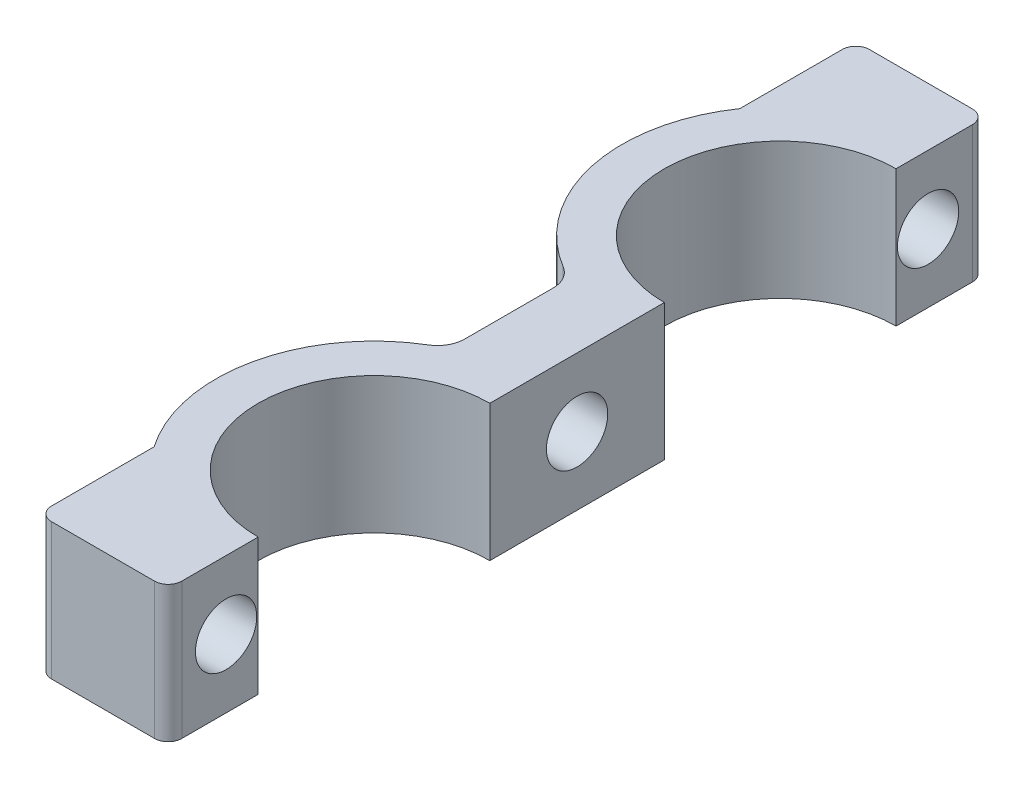
ISO-10303-21;
HEADER;
FILE_DESCRIPTION(('STEP AP214'),'2;1');
FILE_NAME('part.step','',(''),(''),'','','');
FILE_SCHEMA(('AUTOMOTIVE_DESIGN { 1 0 10303 214 1 1 1 1 }'));
ENDSEC;
DATA;
#1=APPLICATION_CONTEXT('core data for automotive mechanical design processes');
#2=APPLICATION_PROTOCOL_DEFINITION('international standard','automotive_design',2000,#1);
#3=PRODUCT_CONTEXT('',#1,'mechanical');
#4=PRODUCT('Part','Part','',(#3));
#5=PRODUCT_RELATED_PRODUCT_CATEGORY('part','',(#4));
#6=PRODUCT_DEFINITION_FORMATION('','',#4);
#7=PRODUCT_DEFINITION_CONTEXT('part definition',#1,'design');
#8=PRODUCT_DEFINITION('design','',#6,#7);
#9=PRODUCT_DEFINITION_SHAPE('','',#8);
#10=(LENGTH_UNIT() NAMED_UNIT(*) SI_UNIT(.MILLI.,.METRE.));
#11=(NAMED_UNIT(*) PLANE_ANGLE_UNIT() SI_UNIT($,.RADIAN.));
#12=(NAMED_UNIT(*) SI_UNIT($,.STERADIAN.) SOLID_ANGLE_UNIT());
#13=UNCERTAINTY_MEASURE_WITH_UNIT(LENGTH_MEASURE(1.E-05),#10,'distance_accuracy_value','');
#14=(GEOMETRIC_REPRESENTATION_CONTEXT(3) GLOBAL_UNCERTAINTY_ASSIGNED_CONTEXT((#13)) GLOBAL_UNIT_ASSIGNED_CONTEXT((#10,
#11,#12)) REPRESENTATION_CONTEXT('',''));
#15=CARTESIAN_POINT('',(0.,0.,0.));
#16=DIRECTION('',(0.,0.,1.));
#17=DIRECTION('',(1.,0.,0.));
#18=AXIS2_PLACEMENT_3D('',#15,#16,#17);
#19=CARTESIAN_POINT('',(0.,10.,0.));
#20=DIRECTION('',(-1.,0.,0.));
#21=DIRECTION('',(0.,0.,1.));
#22=AXIS2_PLACEMENT_3D('',#19,#20,#21);
#23=PLANE('',#22);
#24=DIRECTION('',(0.,0.,-1.));
#25=VECTOR('',#24,1.);
#26=CARTESIAN_POINT('',(0.,0.,0.));
#27=LINE('',#26,#25);
#28=CARTESIAN_POINT('',(0.,0.,-1.));
#29=VERTEX_POINT('',#28);
#30=CARTESIAN_POINT('',(0.,0.,-6.59999999999999));
#31=VERTEX_POINT('',#30);
#32=EDGE_CURVE('E196',#29,#31,#27,.T.);
#33=ORIENTED_EDGE('',*,*,#32,.T.);
#34=DIRECTION('',(0.,1.,0.));
#35=VECTOR('',#34,1.);
#36=CARTESIAN_POINT('',(0.,0.,-6.59999999999999));
#37=LINE('',#36,#35);
#38=CARTESIAN_POINT('',(0.,10.,-6.59999999999999));
#39=VERTEX_POINT('',#38);
#40=EDGE_CURVE('E318',#31,#39,#37,.T.);
#41=ORIENTED_EDGE('',*,*,#40,.T.);
#42=DIRECTION('',(0.,0.,-1.));
#43=VECTOR('',#42,1.);
#44=CARTESIAN_POINT('',(0.,10.,0.));
#45=LINE('',#44,#43);
#46=CARTESIAN_POINT('',(0.,10.,-1.));
#47=VERTEX_POINT('',#46);
#48=EDGE_CURVE('E303',#47,#39,#45,.T.);
#49=ORIENTED_EDGE('',*,*,#48,.F.);
#50=DIRECTION('',(0.,-1.,0.));
#51=VECTOR('',#50,1.);
#52=CARTESIAN_POINT('',(0.,10.,-1.));
#53=LINE('',#52,#51);
#54=EDGE_CURVE('E209',#47,#29,#53,.T.);
#55=ORIENTED_EDGE('',*,*,#54,.T.);
#56=EDGE_LOOP('',(#33,#41,#49,#55));
#57=FACE_BOUND('',#56,.T.);
#58=CARTESIAN_POINT('',(0.,5.,-4.25000000000001));
#59=DIRECTION('',(-1.,0.,0.));
#60=DIRECTION('',(0.,0.,-1.));
#61=AXIS2_PLACEMENT_3D('',#58,#59,#60);
#62=CIRCLE('',#61,2.25);
#63=CARTESIAN_POINT('',(0.,5.,-6.50000000000001));
#64=VERTEX_POINT('',#63);
#65=EDGE_CURVE('E208',#64,#64,#62,.T.);
#66=ORIENTED_EDGE('',*,*,#65,.T.);
#67=EDGE_LOOP('',(#66));
#68=FACE_BOUND('',#67,.T.);
#69=ADVANCED_FACE('F39',(#57,#68),#23,.F.);
#70=CARTESIAN_POINT('',(-9.54984471899927,10.,0.));
#71=DIRECTION('',(1.,0.,0.));
#72=DIRECTION('',(0.,0.,-1.));
#73=AXIS2_PLACEMENT_3D('',#70,#71,#72);
#74=PLANE('',#73);
#75=DIRECTION('',(0.,0.,1.));
#76=VECTOR('',#75,1.);
#77=CARTESIAN_POINT('',(-9.54984471899927,0.,0.));
#78=LINE('',#77,#76);
#79=CARTESIAN_POINT('',(-9.54984471899927,0.,-8.51513357439941));
#80=VERTEX_POINT('',#79);
#81=CARTESIAN_POINT('',(-9.54984471899927,0.,-1.));
#82=VERTEX_POINT('',#81);
#83=EDGE_CURVE('E203',#80,#82,#78,.T.);
#84=ORIENTED_EDGE('',*,*,#83,.T.);
#85=DIRECTION('',(0.,-1.,0.));
#86=VECTOR('',#85,1.);
#87=CARTESIAN_POINT('',(-9.54984471899927,10.,-1.));
#88=LINE('',#87,#86);
#89=CARTESIAN_POINT('',(-9.54984471899927,10.,-1.));
#90=VERTEX_POINT('',#89);
#91=EDGE_CURVE('E236',#82,#90,#88,.F.);
#92=ORIENTED_EDGE('',*,*,#91,.T.);
#93=DIRECTION('',(0.,0.,1.));
#94=VECTOR('',#93,1.);
#95=CARTESIAN_POINT('',(-9.54984471899927,10.,0.));
#96=LINE('',#95,#94);
#97=CARTESIAN_POINT('',(-9.54984471899927,10.,-8.51513357439941));
#98=VERTEX_POINT('',#97);
#99=EDGE_CURVE('E279',#98,#90,#96,.T.);
#100=ORIENTED_EDGE('',*,*,#99,.F.);
#101=DIRECTION('',(0.,-1.,0.));
#102=VECTOR('',#101,1.);
#103=CARTESIAN_POINT('',(-9.54984471899927,10.,-8.51513357439941));
#104=LINE('',#103,#102);
#105=EDGE_CURVE('E275',#98,#80,#104,.T.);
#106=ORIENTED_EDGE('',*,*,#105,.T.);
#107=EDGE_LOOP('',(#84,#92,#100,#106));
#108=FACE_BOUND('',#107,.T.);
#109=CARTESIAN_POINT('',(-9.54984471899927,5.,-4.25000000000001));
#110=DIRECTION('',(1.,0.,0.));
#111=DIRECTION('',(0.,0.,-1.));
#112=AXIS2_PLACEMENT_3D('',#109,#110,#111);
#113=CIRCLE('',#112,2.25);
#114=CARTESIAN_POINT('',(-9.54984471899927,5.,-6.50000000000001));
#115=VERTEX_POINT('',#114);
#116=EDGE_CURVE('E205',#115,#115,#113,.F.);
#117=ORIENTED_EDGE('',*,*,#116,.F.);
#118=EDGE_LOOP('',(#117));
#119=FACE_BOUND('',#118,.T.);
#120=ADVANCED_FACE('F362',(#108,#119),#74,.F.);
#121=CARTESIAN_POINT('',(0.,10.,-60.));
#122=DIRECTION('',(-1.,0.,0.));
#123=DIRECTION('',(0.,0.,1.));
#124=AXIS2_PLACEMENT_3D('',#121,#122,#123);
#125=PLANE('',#124);
#126=DIRECTION('',(0.,0.,-1.));
#127=VECTOR('',#126,1.);
#128=CARTESIAN_POINT('',(0.,10.,-60.));
#129=LINE('',#128,#127);
#130=CARTESIAN_POINT('',(0.,10.,-53.4));
#131=VERTEX_POINT('',#130);
#132=CARTESIAN_POINT('',(0.,10.,-59.));
#133=VERTEX_POINT('',#132);
#134=EDGE_CURVE('E183',#131,#133,#129,.T.);
#135=ORIENTED_EDGE('',*,*,#134,.F.);
#136=DIRECTION('',(0.,1.,0.));
#137=VECTOR('',#136,1.);
#138=CARTESIAN_POINT('',(0.,0.,-53.4));
#139=LINE('',#138,#137);
#140=CARTESIAN_POINT('',(0.,0.,-53.4));
#141=VERTEX_POINT('',#140);
#142=EDGE_CURVE('E166',#141,#131,#139,.T.);
#143=ORIENTED_EDGE('',*,*,#142,.F.);
#144=DIRECTION('',(0.,0.,-1.));
#145=VECTOR('',#144,1.);
#146=CARTESIAN_POINT('',(0.,0.,-60.));
#147=LINE('',#146,#145);
#148=CARTESIAN_POINT('',(0.,0.,-59.));
#149=VERTEX_POINT('',#148);
#150=EDGE_CURVE('E181',#141,#149,#147,.T.);
#151=ORIENTED_EDGE('',*,*,#150,.T.);
#152=DIRECTION('',(0.,-1.,0.));
#153=VECTOR('',#152,1.);
#154=CARTESIAN_POINT('',(0.,10.,-59.));
#155=LINE('',#154,#153);
#156=EDGE_CURVE('E227',#149,#133,#155,.F.);
#157=ORIENTED_EDGE('',*,*,#156,.T.);
#158=EDGE_LOOP('',(#135,#143,#151,#157));
#159=FACE_BOUND('',#158,.T.);
#160=CARTESIAN_POINT('',(0.,5.,-55.75));
#161=DIRECTION('',(-1.,0.,0.));
#162=DIRECTION('',(0.,0.,1.));
#163=AXIS2_PLACEMENT_3D('',#160,#161,#162);
#164=CIRCLE('',#163,2.25);
#165=CARTESIAN_POINT('',(0.,5.,-53.5));
#166=VERTEX_POINT('',#165);
#167=EDGE_CURVE('E204',#166,#166,#164,.T.);
#168=ORIENTED_EDGE('',*,*,#167,.T.);
#169=EDGE_LOOP('',(#168));
#170=FACE_BOUND('',#169,.T.);
#171=ADVANCED_FACE('F178',(#159,#170),#125,.F.);
#172=CARTESIAN_POINT('',(-9.54984471899922,10.,0.));
#173=DIRECTION('',(1.,0.,0.));
#174=DIRECTION('',(0.,0.,-1.));
#175=AXIS2_PLACEMENT_3D('',#172,#173,#174);
#176=PLANE('',#175);
#177=DIRECTION('',(0.,0.,1.));
#178=VECTOR('',#177,1.);
#179=CARTESIAN_POINT('',(-9.54984471899922,10.,0.));
#180=LINE('',#179,#178);
#181=CARTESIAN_POINT('',(-9.54984471899923,10.,-59.));
#182=VERTEX_POINT('',#181);
#183=CARTESIAN_POINT('',(-9.54984471899923,10.,-51.4848664256006));
#184=VERTEX_POINT('',#183);
#185=EDGE_CURVE('E288',#182,#184,#180,.T.);
#186=ORIENTED_EDGE('',*,*,#185,.F.);
#187=DIRECTION('',(0.,-1.,0.));
#188=VECTOR('',#187,1.);
#189=CARTESIAN_POINT('',(-9.54984471899923,10.,-59.));
#190=LINE('',#189,#188);
#191=CARTESIAN_POINT('',(-9.54984471899923,0.,-59.));
#192=VERTEX_POINT('',#191);
#193=EDGE_CURVE('E242',#182,#192,#190,.T.);
#194=ORIENTED_EDGE('',*,*,#193,.T.);
#195=DIRECTION('',(0.,0.,1.));
#196=VECTOR('',#195,1.);
#197=CARTESIAN_POINT('',(-9.54984471899922,0.,0.));
#198=LINE('',#197,#196);
#199=CARTESIAN_POINT('',(-9.54984471899923,0.,-51.4848664256006));
#200=VERTEX_POINT('',#199);
#201=EDGE_CURVE('E283',#192,#200,#198,.T.);
#202=ORIENTED_EDGE('',*,*,#201,.T.);
#203=DIRECTION('',(0.,-1.,0.));
#204=VECTOR('',#203,1.);
#205=CARTESIAN_POINT('',(-9.54984471899923,10.,-51.4848664256006));
#206=LINE('',#205,#204);
#207=EDGE_CURVE('E297',#184,#200,#206,.T.);
#208=ORIENTED_EDGE('',*,*,#207,.F.);
#209=EDGE_LOOP('',(#186,#194,#202,#208));
#210=FACE_BOUND('',#209,.T.);
#211=CARTESIAN_POINT('',(-9.54984471899923,5.,-55.75));
#212=DIRECTION('',(1.,0.,0.));
#213=DIRECTION('',(0.,0.,-1.));
#214=AXIS2_PLACEMENT_3D('',#211,#212,#213);
#215=CIRCLE('',#214,2.25);
#216=CARTESIAN_POINT('',(-9.54984471899923,5.,-58.));
#217=VERTEX_POINT('',#216);
#218=EDGE_CURVE('E200',#217,#217,#215,.F.);
#219=ORIENTED_EDGE('',*,*,#218,.F.);
#220=EDGE_LOOP('',(#219));
#221=FACE_BOUND('',#220,.T.);
#222=ADVANCED_FACE('F350',(#210,#221),#176,.F.);
#223=CARTESIAN_POINT('',(-3.,10.,0.));
#224=DIRECTION('',(0.,0.,-1.));
#225=DIRECTION('',(-1.,0.,0.));
#226=AXIS2_PLACEMENT_3D('',#223,#224,#225);
#227=PLANE('',#226);
#228=DIRECTION('',(1.,0.,0.));
#229=VECTOR('',#228,1.);
#230=CARTESIAN_POINT('',(-3.,10.,0.));
#231=LINE('',#230,#229);
#232=CARTESIAN_POINT('',(-8.54984471899927,10.,0.));
#233=VERTEX_POINT('',#232);
#234=CARTESIAN_POINT('',(-1.,10.,0.));
#235=VERTEX_POINT('',#234);
#236=EDGE_CURVE('E194',#233,#235,#231,.T.);
#237=ORIENTED_EDGE('',*,*,#236,.F.);
#238=DIRECTION('',(0.,-1.,0.));
#239=VECTOR('',#238,1.);
#240=CARTESIAN_POINT('',(-8.54984471899927,10.,0.));
#241=LINE('',#240,#239);
#242=CARTESIAN_POINT('',(-8.54984471899927,0.,0.));
#243=VERTEX_POINT('',#242);
#244=EDGE_CURVE('E229',#233,#243,#241,.T.);
#245=ORIENTED_EDGE('',*,*,#244,.T.);
#246=DIRECTION('',(1.,0.,0.));
#247=VECTOR('',#246,1.);
#248=CARTESIAN_POINT('',(-3.,0.,0.));
#249=LINE('',#248,#247);
#250=CARTESIAN_POINT('',(-1.,0.,0.));
#251=VERTEX_POINT('',#250);
#252=EDGE_CURVE('E300',#243,#251,#249,.T.);
#253=ORIENTED_EDGE('',*,*,#252,.T.);
#254=DIRECTION('',(0.,-1.,0.));
#255=VECTOR('',#254,1.);
#256=CARTESIAN_POINT('',(-1.,10.,0.));
#257=LINE('',#256,#255);
#258=EDGE_CURVE('E217',#251,#235,#257,.F.);
#259=ORIENTED_EDGE('',*,*,#258,.T.);
#260=EDGE_LOOP('',(#237,#245,#253,#259));
#261=FACE_BOUND('',#260,.T.);
#262=ADVANCED_FACE('F352',(#261),#227,.F.);
#263=CARTESIAN_POINT('',(0.,10.,-37.8));
#264=DIRECTION('',(-1.,0.,0.));
#265=DIRECTION('',(0.,0.,1.));
#266=AXIS2_PLACEMENT_3D('',#263,#264,#265);
#267=PLANE('',#266);
#268=CARTESIAN_POINT('',(0.,5.,-30.));
#269=DIRECTION('',(-1.,0.,0.));
#270=DIRECTION('',(0.,0.,1.));
#271=AXIS2_PLACEMENT_3D('',#268,#269,#270);
#272=CIRCLE('',#271,2.25);
#273=CARTESIAN_POINT('',(0.,5.,-27.75));
#274=VERTEX_POINT('',#273);
#275=EDGE_CURVE('E334',#274,#274,#272,.T.);
#276=ORIENTED_EDGE('',*,*,#275,.T.);
#277=EDGE_LOOP('',(#276));
#278=FACE_BOUND('',#277,.T.);
#279=DIRECTION('',(0.,0.,-1.));
#280=VECTOR('',#279,1.);
#281=CARTESIAN_POINT('',(0.,0.,-37.8));
#282=LINE('',#281,#280);
#283=CARTESIAN_POINT('',(0.,0.,-23.6));
#284=VERTEX_POINT('',#283);
#285=CARTESIAN_POINT('',(0.,0.,-36.4));
#286=VERTEX_POINT('',#285);
#287=EDGE_CURVE('E191',#284,#286,#282,.T.);
#288=ORIENTED_EDGE('',*,*,#287,.T.);
#289=DIRECTION('',(0.,1.,0.));
#290=VECTOR('',#289,1.);
#291=CARTESIAN_POINT('',(0.,0.,-36.4));
#292=LINE('',#291,#290);
#293=CARTESIAN_POINT('',(0.,10.,-36.4));
#294=VERTEX_POINT('',#293);
#295=EDGE_CURVE('E169',#286,#294,#292,.T.);
#296=ORIENTED_EDGE('',*,*,#295,.T.);
#297=DIRECTION('',(0.,0.,-1.));
#298=VECTOR('',#297,1.);
#299=CARTESIAN_POINT('',(0.,10.,-37.8));
#300=LINE('',#299,#298);
#301=CARTESIAN_POINT('',(0.,10.,-23.6));
#302=VERTEX_POINT('',#301);
#303=EDGE_CURVE('E306',#302,#294,#300,.T.);
#304=ORIENTED_EDGE('',*,*,#303,.F.);
#305=DIRECTION('',(0.,1.,0.));
#306=VECTOR('',#305,1.);
#307=CARTESIAN_POINT('',(0.,0.,-23.6));
#308=LINE('',#307,#306);
#309=EDGE_CURVE('E325',#284,#302,#308,.T.);
#310=ORIENTED_EDGE('',*,*,#309,.F.);
#311=EDGE_LOOP('',(#288,#296,#304,#310));
#312=FACE_BOUND('',#311,.T.);
#313=ADVANCED_FACE('F359',(#278,#312),#267,.F.);
#314=CARTESIAN_POINT('',(-3.,10.,-60.));
#315=DIRECTION('',(0.,0.,1.));
#316=DIRECTION('',(1.,0.,0.));
#317=AXIS2_PLACEMENT_3D('',#314,#315,#316);
#318=PLANE('',#317);
#319=DIRECTION('',(-1.,0.,0.));
#320=VECTOR('',#319,1.);
#321=CARTESIAN_POINT('',(-3.,0.,-60.));
#322=LINE('',#321,#320);
#323=CARTESIAN_POINT('',(-1.,0.,-60.));
#324=VERTEX_POINT('',#323);
#325=CARTESIAN_POINT('',(-8.54984471899923,0.,-60.));
#326=VERTEX_POINT('',#325);
#327=EDGE_CURVE('E190',#324,#326,#322,.T.);
#328=ORIENTED_EDGE('',*,*,#327,.T.);
#329=DIRECTION('',(0.,-1.,0.));
#330=VECTOR('',#329,1.);
#331=CARTESIAN_POINT('',(-8.54984471899923,10.,-60.));
#332=LINE('',#331,#330);
#333=CARTESIAN_POINT('',(-8.54984471899923,10.,-60.));
#334=VERTEX_POINT('',#333);
#335=EDGE_CURVE('E245',#326,#334,#332,.F.);
#336=ORIENTED_EDGE('',*,*,#335,.T.);
#337=DIRECTION('',(-1.,0.,0.));
#338=VECTOR('',#337,1.);
#339=CARTESIAN_POINT('',(-3.,10.,-60.));
#340=LINE('',#339,#338);
#341=CARTESIAN_POINT('',(-1.,10.,-60.));
#342=VERTEX_POINT('',#341);
#343=EDGE_CURVE('E212',#342,#334,#340,.T.);
#344=ORIENTED_EDGE('',*,*,#343,.F.);
#345=DIRECTION('',(0.,-1.,0.));
#346=VECTOR('',#345,1.);
#347=CARTESIAN_POINT('',(-1.,10.,-60.));
#348=LINE('',#347,#346);
#349=EDGE_CURVE('E224',#342,#324,#348,.T.);
#350=ORIENTED_EDGE('',*,*,#349,.T.);
#351=EDGE_LOOP('',(#328,#336,#344,#350));
#352=FACE_BOUND('',#351,.T.);
#353=ADVANCED_FACE('F411',(#352),#318,.F.);
#354=CARTESIAN_POINT('',(0.,10.,-15.1));
#355=DIRECTION('',(0.,-1.,0.));
#356=DIRECTION('',(0.,0.,-1.));
#357=AXIS2_PLACEMENT_3D('',#354,#355,#356);
#358=PLANE('',#357);
#359=ORIENTED_EDGE('',*,*,#99,.T.);
#360=CARTESIAN_POINT('',(-8.54984471899927,10.,-1.));
#361=DIRECTION('',(0.,-1.,0.));
#362=DIRECTION('',(0.,0.,-1.));
#363=AXIS2_PLACEMENT_3D('',#360,#361,#362);
#364=CIRCLE('',#363,1.);
#365=EDGE_CURVE('E240',#90,#233,#364,.F.);
#366=ORIENTED_EDGE('',*,*,#365,.T.);
#367=ORIENTED_EDGE('',*,*,#236,.T.);
#368=CARTESIAN_POINT('',(-1.,10.,-1.));
#369=DIRECTION('',(0.,-1.,0.));
#370=DIRECTION('',(0.,0.,-1.));
#371=AXIS2_PLACEMENT_3D('',#368,#369,#370);
#372=CIRCLE('',#371,1.);
#373=EDGE_CURVE('E222',#235,#47,#372,.F.);
#374=ORIENTED_EDGE('',*,*,#373,.T.);
#375=ORIENTED_EDGE('',*,*,#48,.T.);
#376=CARTESIAN_POINT('',(0.,10.,-15.1));
#377=DIRECTION('',(0.,1.,0.));
#378=DIRECTION('',(0.,0.,1.));
#379=AXIS2_PLACEMENT_3D('',#376,#377,#378);
#380=CIRCLE('',#379,8.5);
#381=EDGE_CURVE('E326',#302,#39,#380,.T.);
#382=ORIENTED_EDGE('',*,*,#381,.F.);
#383=ORIENTED_EDGE('',*,*,#303,.T.);
#384=CARTESIAN_POINT('',(0.,10.,-44.9));
#385=DIRECTION('',(0.,1.,0.));
#386=DIRECTION('',(0.,0.,1.));
#387=AXIS2_PLACEMENT_3D('',#384,#385,#386);
#388=CIRCLE('',#387,8.49999999999999);
#389=EDGE_CURVE('E174',#131,#294,#388,.T.);
#390=ORIENTED_EDGE('',*,*,#389,.F.);
#391=ORIENTED_EDGE('',*,*,#134,.T.);
#392=CARTESIAN_POINT('',(-1.,10.,-59.));
#393=DIRECTION('',(0.,-1.,0.));
#394=DIRECTION('',(0.,0.,-1.));
#395=AXIS2_PLACEMENT_3D('',#392,#393,#394);
#396=CIRCLE('',#395,1.);
#397=EDGE_CURVE('E220',#133,#342,#396,.F.);
#398=ORIENTED_EDGE('',*,*,#397,.T.);
#399=ORIENTED_EDGE('',*,*,#343,.T.);
#400=CARTESIAN_POINT('',(-8.54984471899923,10.,-59.));
#401=DIRECTION('',(0.,-1.,0.));
#402=DIRECTION('',(0.,0.,-1.));
#403=AXIS2_PLACEMENT_3D('',#400,#401,#402);
#404=CIRCLE('',#403,1.);
#405=EDGE_CURVE('E238',#334,#182,#404,.F.);
#406=ORIENTED_EDGE('',*,*,#405,.T.);
#407=ORIENTED_EDGE('',*,*,#185,.T.);
#408=CARTESIAN_POINT('',(0.,10.,-44.9));
#409=DIRECTION('',(0.,-1.,0.));
#410=DIRECTION('',(0.,0.,-1.));
#411=AXIS2_PLACEMENT_3D('',#408,#409,#410);
#412=CIRCLE('',#411,11.6);
#413=CARTESIAN_POINT('',(-5.97058823529412,10.,-34.9545449513576));
#414=VERTEX_POINT('',#413);
#415=EDGE_CURVE('E281',#414,#184,#412,.T.);
#416=ORIENTED_EDGE('',*,*,#415,.F.);
#417=CARTESIAN_POINT('',(-7.00000000000001,10.,-33.2398113222813));
#418=DIRECTION('',(0.,-1.,0.));
#419=DIRECTION('',(0.,0.,-1.));
#420=AXIS2_PLACEMENT_3D('',#417,#418,#419);
#421=CIRCLE('',#420,2.);
#422=CARTESIAN_POINT('',(-5.00000000000001,10.,-33.2398113222813));
#423=VERTEX_POINT('',#422);
#424=EDGE_CURVE('E258',#414,#423,#421,.T.);
#425=ORIENTED_EDGE('',*,*,#424,.T.);
#426=DIRECTION('',(0.,0.,1.));
#427=VECTOR('',#426,1.);
#428=CARTESIAN_POINT('',(-4.99999999999999,10.,0.));
#429=LINE('',#428,#427);
#430=CARTESIAN_POINT('',(-5.,10.,-26.7601886777187));
#431=VERTEX_POINT('',#430);
#432=EDGE_CURVE('E278',#423,#431,#429,.T.);
#433=ORIENTED_EDGE('',*,*,#432,.T.);
#434=CARTESIAN_POINT('',(-7.,10.,-26.7601886777187));
#435=DIRECTION('',(0.,-1.,0.));
#436=DIRECTION('',(0.,0.,-1.));
#437=AXIS2_PLACEMENT_3D('',#434,#435,#436);
#438=CIRCLE('',#437,2.);
#439=CARTESIAN_POINT('',(-5.97058823529412,10.,-25.0454550486424));
#440=VERTEX_POINT('',#439);
#441=EDGE_CURVE('E11',#431,#440,#438,.T.);
#442=ORIENTED_EDGE('',*,*,#441,.T.);
#443=CARTESIAN_POINT('',(0.,10.,-15.1));
#444=DIRECTION('',(0.,-1.,0.));
#445=DIRECTION('',(0.,0.,-1.));
#446=AXIS2_PLACEMENT_3D('',#443,#444,#445);
#447=CIRCLE('',#446,11.6);
#448=EDGE_CURVE('E274',#98,#440,#447,.T.);
#449=ORIENTED_EDGE('',*,*,#448,.F.);
#450=EDGE_LOOP('',(#359,#366,#367,#374,#375,#382,#383,#390,#391,#398,#399,#406,#407,#416,#425,
#433,#442,#449));
#451=FACE_BOUND('',#450,.T.);
#452=ADVANCED_FACE('F401',(#451),#358,.F.);
#453=CARTESIAN_POINT('',(0.,0.,-15.1));
#454=DIRECTION('',(0.,-1.,0.));
#455=DIRECTION('',(0.,0.,-1.));
#456=AXIS2_PLACEMENT_3D('',#453,#454,#455);
#457=PLANE('',#456);
#458=ORIENTED_EDGE('',*,*,#252,.F.);
#459=CARTESIAN_POINT('',(-8.54984471899927,0.,-1.));
#460=DIRECTION('',(0.,-1.,0.));
#461=DIRECTION('',(0.,0.,-1.));
#462=AXIS2_PLACEMENT_3D('',#459,#460,#461);
#463=CIRCLE('',#462,1.);
#464=EDGE_CURVE('E234',#243,#82,#463,.T.);
#465=ORIENTED_EDGE('',*,*,#464,.T.);
#466=ORIENTED_EDGE('',*,*,#83,.F.);
#467=CARTESIAN_POINT('',(0.,0.,-15.1));
#468=DIRECTION('',(0.,-1.,0.));
#469=DIRECTION('',(0.,0.,-1.));
#470=AXIS2_PLACEMENT_3D('',#467,#468,#469);
#471=CIRCLE('',#470,11.6);
#472=CARTESIAN_POINT('',(-5.97058823529412,0.,-25.0454550486424));
#473=VERTEX_POINT('',#472);
#474=EDGE_CURVE('E265',#80,#473,#471,.T.);
#475=ORIENTED_EDGE('',*,*,#474,.T.);
#476=CARTESIAN_POINT('',(-7.,0.,-26.7601886777187));
#477=DIRECTION('',(0.,-1.,0.));
#478=DIRECTION('',(0.,0.,-1.));
#479=AXIS2_PLACEMENT_3D('',#476,#477,#478);
#480=CIRCLE('',#479,2.);
#481=CARTESIAN_POINT('',(-5.,0.,-26.7601886777187));
#482=VERTEX_POINT('',#481);
#483=EDGE_CURVE('E47',#473,#482,#480,.F.);
#484=ORIENTED_EDGE('',*,*,#483,.T.);
#485=DIRECTION('',(0.,0.,1.));
#486=VECTOR('',#485,1.);
#487=CARTESIAN_POINT('',(-4.99999999999999,0.,0.));
#488=LINE('',#487,#486);
#489=CARTESIAN_POINT('',(-5.00000000000001,0.,-33.2398113222813));
#490=VERTEX_POINT('',#489);
#491=EDGE_CURVE('E262',#490,#482,#488,.T.);
#492=ORIENTED_EDGE('',*,*,#491,.F.);
#493=CARTESIAN_POINT('',(-7.00000000000001,0.,-33.2398113222813));
#494=DIRECTION('',(0.,-1.,0.));
#495=DIRECTION('',(0.,0.,-1.));
#496=AXIS2_PLACEMENT_3D('',#493,#494,#495);
#497=CIRCLE('',#496,2.);
#498=CARTESIAN_POINT('',(-5.97058823529412,0.,-34.9545449513576));
#499=VERTEX_POINT('',#498);
#500=EDGE_CURVE('E256',#490,#499,#497,.F.);
#501=ORIENTED_EDGE('',*,*,#500,.T.);
#502=CARTESIAN_POINT('',(0.,0.,-44.9));
#503=DIRECTION('',(0.,-1.,0.));
#504=DIRECTION('',(0.,0.,-1.));
#505=AXIS2_PLACEMENT_3D('',#502,#503,#504);
#506=CIRCLE('',#505,11.6);
#507=EDGE_CURVE('E270',#499,#200,#506,.T.);
#508=ORIENTED_EDGE('',*,*,#507,.T.);
#509=ORIENTED_EDGE('',*,*,#201,.F.);
#510=CARTESIAN_POINT('',(-8.54984471899923,0.,-59.));
#511=DIRECTION('',(0.,-1.,0.));
#512=DIRECTION('',(0.,0.,-1.));
#513=AXIS2_PLACEMENT_3D('',#510,#511,#512);
#514=CIRCLE('',#513,1.);
#515=EDGE_CURVE('E232',#192,#326,#514,.T.);
#516=ORIENTED_EDGE('',*,*,#515,.T.);
#517=ORIENTED_EDGE('',*,*,#327,.F.);
#518=CARTESIAN_POINT('',(-1.,0.,-59.));
#519=DIRECTION('',(0.,-1.,0.));
#520=DIRECTION('',(0.,0.,-1.));
#521=AXIS2_PLACEMENT_3D('',#518,#519,#520);
#522=CIRCLE('',#521,1.);
#523=EDGE_CURVE('E188',#324,#149,#522,.T.);
#524=ORIENTED_EDGE('',*,*,#523,.T.);
#525=ORIENTED_EDGE('',*,*,#150,.F.);
#526=CARTESIAN_POINT('',(0.,0.,-44.9));
#527=DIRECTION('',(0.,1.,0.));
#528=DIRECTION('',(0.,0.,1.));
#529=AXIS2_PLACEMENT_3D('',#526,#527,#528);
#530=CIRCLE('',#529,8.49999999999999);
#531=EDGE_CURVE('E163',#141,#286,#530,.T.);
#532=ORIENTED_EDGE('',*,*,#531,.T.);
#533=ORIENTED_EDGE('',*,*,#287,.F.);
#534=CARTESIAN_POINT('',(0.,0.,-15.1));
#535=DIRECTION('',(0.,1.,0.));
#536=DIRECTION('',(0.,0.,1.));
#537=AXIS2_PLACEMENT_3D('',#534,#535,#536);
#538=CIRCLE('',#537,8.5);
#539=EDGE_CURVE('E322',#284,#31,#538,.T.);
#540=ORIENTED_EDGE('',*,*,#539,.T.);
#541=ORIENTED_EDGE('',*,*,#32,.F.);
#542=CARTESIAN_POINT('',(-1.,0.,-1.));
#543=DIRECTION('',(0.,-1.,0.));
#544=DIRECTION('',(0.,0.,-1.));
#545=AXIS2_PLACEMENT_3D('',#542,#543,#544);
#546=CIRCLE('',#545,1.);
#547=EDGE_CURVE('E214',#29,#251,#546,.T.);
#548=ORIENTED_EDGE('',*,*,#547,.T.);
#549=EDGE_LOOP('',(#458,#465,#466,#475,#484,#492,#501,#508,#509,#516,#517,#524,#525,#532,#533,
#540,#541,#548));
#550=FACE_BOUND('',#549,.T.);
#551=ADVANCED_FACE('F186',(#550),#457,.T.);
#552=CARTESIAN_POINT('',(0.,10.,-44.9));
#553=DIRECTION('',(0.,-1.,0.));
#554=DIRECTION('',(0.,0.,-1.));
#555=AXIS2_PLACEMENT_3D('',#552,#553,#554);
#556=CYLINDRICAL_SURFACE('',#555,11.6);
#557=ORIENTED_EDGE('',*,*,#507,.F.);
#558=DIRECTION('',(0.,-1.,0.));
#559=VECTOR('',#558,1.);
#560=CARTESIAN_POINT('',(-5.97058823529412,10.,-34.9545449513576));
#561=LINE('',#560,#559);
#562=EDGE_CURVE('E252',#499,#414,#561,.F.);
#563=ORIENTED_EDGE('',*,*,#562,.T.);
#564=ORIENTED_EDGE('',*,*,#415,.T.);
#565=ORIENTED_EDGE('',*,*,#207,.T.);
#566=EDGE_LOOP('',(#557,#563,#564,#565));
#567=FACE_BOUND('',#566,.T.);
#568=ADVANCED_FACE('F405',(#567),#556,.T.);
#569=CARTESIAN_POINT('',(-4.99999999999999,10.,0.));
#570=DIRECTION('',(1.,0.,0.));
#571=DIRECTION('',(0.,0.,-1.));
#572=AXIS2_PLACEMENT_3D('',#569,#570,#571);
#573=PLANE('',#572);
#574=CARTESIAN_POINT('',(-5.,5.,-30.));
#575=DIRECTION('',(-1.,0.,0.));
#576=DIRECTION('',(0.,0.,1.));
#577=AXIS2_PLACEMENT_3D('',#574,#575,#576);
#578=CIRCLE('',#577,2.25);
#579=CARTESIAN_POINT('',(-5.,5.,-27.75));
#580=VERTEX_POINT('',#579);
#581=EDGE_CURVE('E332',#580,#580,#578,.T.);
#582=ORIENTED_EDGE('',*,*,#581,.F.);
#583=EDGE_LOOP('',(#582));
#584=FACE_BOUND('',#583,.T.);
#585=ORIENTED_EDGE('',*,*,#432,.F.);
#586=DIRECTION('',(0.,-1.,0.));
#587=VECTOR('',#586,1.);
#588=CARTESIAN_POINT('',(-5.00000000000001,10.,-33.2398113222813));
#589=LINE('',#588,#587);
#590=EDGE_CURVE('E249',#423,#490,#589,.T.);
#591=ORIENTED_EDGE('',*,*,#590,.T.);
#592=ORIENTED_EDGE('',*,*,#491,.T.);
#593=DIRECTION('',(0.,-1.,0.));
#594=VECTOR('',#593,1.);
#595=CARTESIAN_POINT('',(-5.,10.,-26.7601886777187));
#596=LINE('',#595,#594);
#597=EDGE_CURVE('E247',#482,#431,#596,.F.);
#598=ORIENTED_EDGE('',*,*,#597,.T.);
#599=EDGE_LOOP('',(#585,#591,#592,#598));
#600=FACE_BOUND('',#599,.T.);
#601=ADVANCED_FACE('F268',(#584,#600),#573,.F.);
#602=CARTESIAN_POINT('',(0.,10.,-15.1));
#603=DIRECTION('',(0.,-1.,0.));
#604=DIRECTION('',(0.,0.,-1.));
#605=AXIS2_PLACEMENT_3D('',#602,#603,#604);
#606=CYLINDRICAL_SURFACE('',#605,11.6);
#607=ORIENTED_EDGE('',*,*,#448,.T.);
#608=DIRECTION('',(0.,-1.,0.));
#609=VECTOR('',#608,1.);
#610=CARTESIAN_POINT('',(-5.97058823529412,10.,-25.0454550486424));
#611=LINE('',#610,#609);
#612=EDGE_CURVE('E254',#440,#473,#611,.T.);
#613=ORIENTED_EDGE('',*,*,#612,.T.);
#614=ORIENTED_EDGE('',*,*,#474,.F.);
#615=ORIENTED_EDGE('',*,*,#105,.F.);
#616=EDGE_LOOP('',(#607,#613,#614,#615));
#617=FACE_BOUND('',#616,.T.);
#618=ADVANCED_FACE('F273',(#617),#606,.T.);
#619=CARTESIAN_POINT('',(-11.6,5.,-55.75));
#620=DIRECTION('',(1.,0.,0.));
#621=DIRECTION('',(0.,0.,-1.));
#622=AXIS2_PLACEMENT_3D('',#619,#620,#621);
#623=CYLINDRICAL_SURFACE('',#622,2.25);
#624=ORIENTED_EDGE('',*,*,#167,.F.);
#625=EDGE_LOOP('',(#624));
#626=FACE_BOUND('',#625,.T.);
#627=ORIENTED_EDGE('',*,*,#218,.T.);
#628=EDGE_LOOP('',(#627));
#629=FACE_BOUND('',#628,.T.);
#630=ADVANCED_FACE('F343',(#626,#629),#623,.F.);
#631=CARTESIAN_POINT('',(-11.6,5.,-4.25000000000001));
#632=DIRECTION('',(1.,0.,0.));
#633=DIRECTION('',(0.,0.,-1.));
#634=AXIS2_PLACEMENT_3D('',#631,#632,#633);
#635=CYLINDRICAL_SURFACE('',#634,2.25);
#636=ORIENTED_EDGE('',*,*,#65,.F.);
#637=EDGE_LOOP('',(#636));
#638=FACE_BOUND('',#637,.T.);
#639=ORIENTED_EDGE('',*,*,#116,.T.);
#640=EDGE_LOOP('',(#639));
#641=FACE_BOUND('',#640,.T.);
#642=ADVANCED_FACE('F346',(#638,#641),#635,.F.);
#643=CARTESIAN_POINT('',(0.,5.,-30.));
#644=DIRECTION('',(-1.,0.,0.));
#645=DIRECTION('',(0.,0.,1.));
#646=AXIS2_PLACEMENT_3D('',#643,#644,#645);
#647=CYLINDRICAL_SURFACE('',#646,2.25);
#648=ORIENTED_EDGE('',*,*,#275,.F.);
#649=EDGE_LOOP('',(#648));
#650=FACE_BOUND('',#649,.T.);
#651=ORIENTED_EDGE('',*,*,#581,.T.);
#652=EDGE_LOOP('',(#651));
#653=FACE_BOUND('',#652,.T.);
#654=ADVANCED_FACE('F379',(#650,#653),#647,.F.);
#655=CARTESIAN_POINT('',(-1.,10.,-1.));
#656=DIRECTION('',(0.,-1.,0.));
#657=DIRECTION('',(0.,0.,-1.));
#658=AXIS2_PLACEMENT_3D('',#655,#656,#657);
#659=CYLINDRICAL_SURFACE('',#658,1.);
#660=ORIENTED_EDGE('',*,*,#373,.F.);
#661=ORIENTED_EDGE('',*,*,#258,.F.);
#662=ORIENTED_EDGE('',*,*,#547,.F.);
#663=ORIENTED_EDGE('',*,*,#54,.F.);
#664=EDGE_LOOP('',(#660,#661,#662,#663));
#665=FACE_BOUND('',#664,.T.);
#666=ADVANCED_FACE('F375',(#665),#659,.T.);
#667=CARTESIAN_POINT('',(-1.,10.,-59.));
#668=DIRECTION('',(0.,-1.,0.));
#669=DIRECTION('',(0.,0.,-1.));
#670=AXIS2_PLACEMENT_3D('',#667,#668,#669);
#671=CYLINDRICAL_SURFACE('',#670,1.);
#672=ORIENTED_EDGE('',*,*,#397,.F.);
#673=ORIENTED_EDGE('',*,*,#156,.F.);
#674=ORIENTED_EDGE('',*,*,#523,.F.);
#675=ORIENTED_EDGE('',*,*,#349,.F.);
#676=EDGE_LOOP('',(#672,#673,#674,#675));
#677=FACE_BOUND('',#676,.T.);
#678=ADVANCED_FACE('F378',(#677),#671,.T.);
#679=CARTESIAN_POINT('',(0.,0.,-15.1));
#680=DIRECTION('',(0.,1.,0.));
#681=DIRECTION('',(0.,0.,1.));
#682=AXIS2_PLACEMENT_3D('',#679,#680,#681);
#683=CYLINDRICAL_SURFACE('',#682,8.5);
#684=ORIENTED_EDGE('',*,*,#381,.T.);
#685=ORIENTED_EDGE('',*,*,#40,.F.);
#686=ORIENTED_EDGE('',*,*,#539,.F.);
#687=ORIENTED_EDGE('',*,*,#309,.T.);
#688=EDGE_LOOP('',(#684,#685,#686,#687));
#689=FACE_BOUND('',#688,.T.);
#690=ADVANCED_FACE('F383',(#689),#683,.F.);
#691=CARTESIAN_POINT('',(0.,0.,-44.9));
#692=DIRECTION('',(0.,1.,0.));
#693=DIRECTION('',(0.,0.,1.));
#694=AXIS2_PLACEMENT_3D('',#691,#692,#693);
#695=CYLINDRICAL_SURFACE('',#694,8.49999999999999);
#696=ORIENTED_EDGE('',*,*,#389,.T.);
#697=ORIENTED_EDGE('',*,*,#295,.F.);
#698=ORIENTED_EDGE('',*,*,#531,.F.);
#699=ORIENTED_EDGE('',*,*,#142,.T.);
#700=EDGE_LOOP('',(#696,#697,#698,#699));
#701=FACE_BOUND('',#700,.T.);
#702=ADVANCED_FACE('F165',(#701),#695,.F.);
#703=CARTESIAN_POINT('',(-8.54984471899927,10.,-1.));
#704=DIRECTION('',(0.,-1.,0.));
#705=DIRECTION('',(0.,0.,-1.));
#706=AXIS2_PLACEMENT_3D('',#703,#704,#705);
#707=CYLINDRICAL_SURFACE('',#706,1.);
#708=ORIENTED_EDGE('',*,*,#365,.F.);
#709=ORIENTED_EDGE('',*,*,#91,.F.);
#710=ORIENTED_EDGE('',*,*,#464,.F.);
#711=ORIENTED_EDGE('',*,*,#244,.F.);
#712=EDGE_LOOP('',(#708,#709,#710,#711));
#713=FACE_BOUND('',#712,.T.);
#714=ADVANCED_FACE('F385',(#713),#707,.T.);
#715=CARTESIAN_POINT('',(-8.54984471899923,10.,-59.));
#716=DIRECTION('',(0.,-1.,0.));
#717=DIRECTION('',(0.,0.,-1.));
#718=AXIS2_PLACEMENT_3D('',#715,#716,#717);
#719=CYLINDRICAL_SURFACE('',#718,1.);
#720=ORIENTED_EDGE('',*,*,#405,.F.);
#721=ORIENTED_EDGE('',*,*,#335,.F.);
#722=ORIENTED_EDGE('',*,*,#515,.F.);
#723=ORIENTED_EDGE('',*,*,#193,.F.);
#724=EDGE_LOOP('',(#720,#721,#722,#723));
#725=FACE_BOUND('',#724,.T.);
#726=ADVANCED_FACE('F388',(#725),#719,.T.);
#727=CARTESIAN_POINT('',(-7.00000000000001,10.,-33.2398113222813));
#728=DIRECTION('',(0.,-1.,0.));
#729=DIRECTION('',(0.,0.,-1.));
#730=AXIS2_PLACEMENT_3D('',#727,#728,#729);
#731=CYLINDRICAL_SURFACE('',#730,2.);
#732=ORIENTED_EDGE('',*,*,#424,.F.);
#733=ORIENTED_EDGE('',*,*,#562,.F.);
#734=ORIENTED_EDGE('',*,*,#500,.F.);
#735=ORIENTED_EDGE('',*,*,#590,.F.);
#736=EDGE_LOOP('',(#732,#733,#734,#735));
#737=FACE_BOUND('',#736,.T.);
#738=ADVANCED_FACE('F391',(#737),#731,.F.);
#739=CARTESIAN_POINT('',(-7.,10.,-26.7601886777187));
#740=DIRECTION('',(0.,-1.,0.));
#741=DIRECTION('',(0.,0.,-1.));
#742=AXIS2_PLACEMENT_3D('',#739,#740,#741);
#743=CYLINDRICAL_SURFACE('',#742,2.);
#744=ORIENTED_EDGE('',*,*,#441,.F.);
#745=ORIENTED_EDGE('',*,*,#597,.F.);
#746=ORIENTED_EDGE('',*,*,#483,.F.);
#747=ORIENTED_EDGE('',*,*,#612,.F.);
#748=EDGE_LOOP('',(#744,#745,#746,#747));
#749=FACE_BOUND('',#748,.T.);
#750=ADVANCED_FACE('F41',(#749),#743,.F.);
#751=CLOSED_SHELL('',(#69,#120,#171,#222,#262,#313,#353,#452,#551,#568,#601,#618,#630,#642,#654,
#666,#678,#690,#702,#714,#726,#738,#750));
#752=MANIFOLD_SOLID_BREP('B2',#751);
#753=ADVANCED_BREP_SHAPE_REPRESENTATION('',(#18,#752),#14);
#754=SHAPE_DEFINITION_REPRESENTATION(#9,#753);
ENDSEC;
END-ISO-10303-21;
